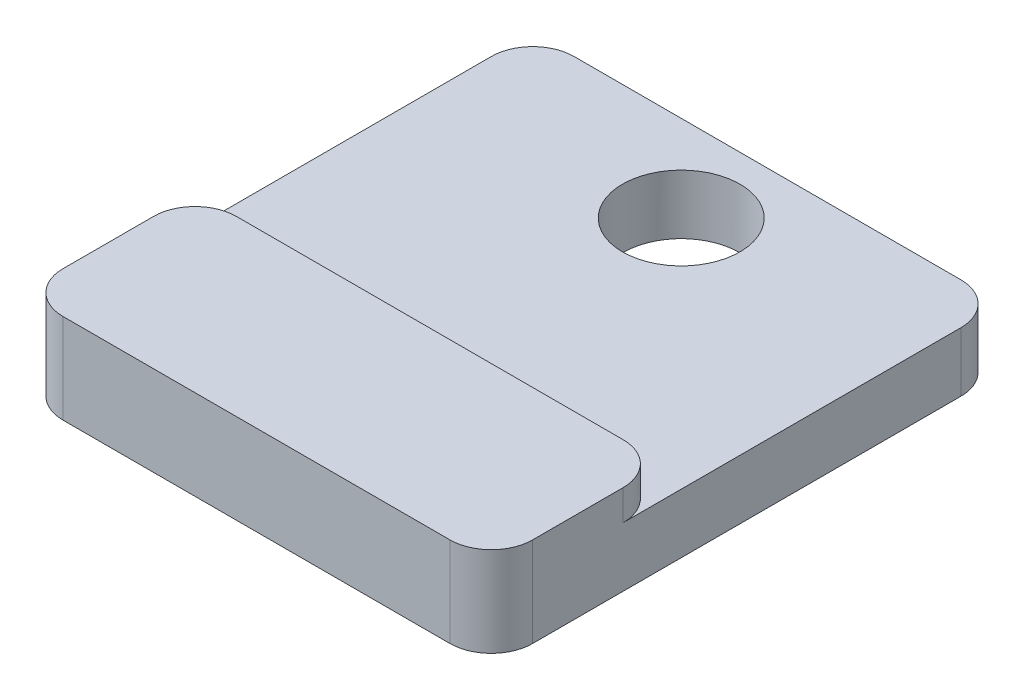
ISO-10303-21;
HEADER;
FILE_DESCRIPTION(('STEP AP214'),'2;1');
FILE_NAME('part.step','',(''),(''),'','','');
FILE_SCHEMA(('AUTOMOTIVE_DESIGN { 1 0 10303 214 1 1 1 1 }'));
ENDSEC;
DATA;
#1=APPLICATION_CONTEXT('core data for automotive mechanical design processes');
#2=APPLICATION_PROTOCOL_DEFINITION('international standard','automotive_design',2000,#1);
#3=PRODUCT_CONTEXT('',#1,'mechanical');
#4=PRODUCT('Part','Part','',(#3));
#5=PRODUCT_RELATED_PRODUCT_CATEGORY('part','',(#4));
#6=PRODUCT_DEFINITION_FORMATION('','',#4);
#7=PRODUCT_DEFINITION_CONTEXT('part definition',#1,'design');
#8=PRODUCT_DEFINITION('design','',#6,#7);
#9=PRODUCT_DEFINITION_SHAPE('','',#8);
#10=(LENGTH_UNIT() NAMED_UNIT(*) SI_UNIT(.MILLI.,.METRE.));
#11=(NAMED_UNIT(*) PLANE_ANGLE_UNIT() SI_UNIT($,.RADIAN.));
#12=(NAMED_UNIT(*) SI_UNIT($,.STERADIAN.) SOLID_ANGLE_UNIT());
#13=UNCERTAINTY_MEASURE_WITH_UNIT(LENGTH_MEASURE(1.E-05),#10,'distance_accuracy_value','');
#14=(GEOMETRIC_REPRESENTATION_CONTEXT(3) GLOBAL_UNCERTAINTY_ASSIGNED_CONTEXT((#13)) GLOBAL_UNIT_ASSIGNED_CONTEXT((#10,
#11,#12)) REPRESENTATION_CONTEXT('',''));
#15=CARTESIAN_POINT('',(0.,0.,0.));
#16=DIRECTION('',(0.,0.,1.));
#17=DIRECTION('',(1.,0.,0.));
#18=AXIS2_PLACEMENT_3D('',#15,#16,#17);
#19=CARTESIAN_POINT('',(0.,41.275,-234.95));
#20=DIRECTION('',(0.,0.,1.));
#21=DIRECTION('',(1.,0.,0.));
#22=AXIS2_PLACEMENT_3D('',#19,#20,#21);
#23=PLANE('',#22);
#24=DIRECTION('',(-1.,0.,0.));
#25=VECTOR('',#24,1.);
#26=CARTESIAN_POINT('',(196.85,27.305,-234.95));
#27=LINE('',#26,#25);
#28=CARTESIAN_POINT('',(196.85,27.305,-234.95));
#29=VERTEX_POINT('',#28);
#30=CARTESIAN_POINT('',(19.05,27.305,-234.95));
#31=VERTEX_POINT('',#30);
#32=EDGE_CURVE('E144',#29,#31,#27,.T.);
#33=ORIENTED_EDGE('',*,*,#32,.F.);
#34=DIRECTION('',(0.,-1.,0.));
#35=VECTOR('',#34,1.);
#36=CARTESIAN_POINT('',(196.85,41.275,-234.95));
#37=LINE('',#36,#35);
#38=CARTESIAN_POINT('',(196.85,0.,-234.95));
#39=VERTEX_POINT('',#38);
#40=EDGE_CURVE('E153',#29,#39,#37,.T.);
#41=ORIENTED_EDGE('',*,*,#40,.T.);
#42=DIRECTION('',(-1.,0.,0.));
#43=VECTOR('',#42,1.);
#44=CARTESIAN_POINT('',(0.,0.,-234.95));
#45=LINE('',#44,#43);
#46=CARTESIAN_POINT('',(19.05,0.,-234.95));
#47=VERTEX_POINT('',#46);
#48=EDGE_CURVE('E234',#39,#47,#45,.T.);
#49=ORIENTED_EDGE('',*,*,#48,.T.);
#50=DIRECTION('',(0.,-1.,0.));
#51=VECTOR('',#50,1.);
#52=CARTESIAN_POINT('',(19.05,41.275,-234.95));
#53=LINE('',#52,#51);
#54=EDGE_CURVE('E156',#47,#31,#53,.F.);
#55=ORIENTED_EDGE('',*,*,#54,.T.);
#56=EDGE_LOOP('',(#33,#41,#49,#55));
#57=FACE_BOUND('',#56,.T.);
#58=ADVANCED_FACE('F47',(#57),#23,.F.);
#59=CARTESIAN_POINT('',(19.05,41.275,-215.9));
#60=DIRECTION('',(0.,-1.,0.));
#61=DIRECTION('',(0.,0.,-1.));
#62=AXIS2_PLACEMENT_3D('',#59,#60,#61);
#63=CYLINDRICAL_SURFACE('',#62,19.05);
#64=DIRECTION('',(0.,-1.,0.));
#65=VECTOR('',#64,1.);
#66=CARTESIAN_POINT('',(0.,41.275,-215.9));
#67=LINE('',#66,#65);
#68=CARTESIAN_POINT('',(0.,27.305,-215.9));
#69=VERTEX_POINT('',#68);
#70=CARTESIAN_POINT('',(0.,0.,-215.9));
#71=VERTEX_POINT('',#70);
#72=EDGE_CURVE('E260',#69,#71,#67,.T.);
#73=ORIENTED_EDGE('',*,*,#72,.F.);
#74=CARTESIAN_POINT('',(19.05,27.305,-215.9));
#75=DIRECTION('',(0.,1.,0.));
#76=DIRECTION('',(0.,0.,1.));
#77=AXIS2_PLACEMENT_3D('',#74,#75,#76);
#78=CIRCLE('',#77,19.05);
#79=EDGE_CURVE('E157',#31,#69,#78,.T.);
#80=ORIENTED_EDGE('',*,*,#79,.F.);
#81=ORIENTED_EDGE('',*,*,#54,.F.);
#82=CARTESIAN_POINT('',(19.05,0.,-215.9));
#83=DIRECTION('',(0.,-1.,0.));
#84=DIRECTION('',(0.,0.,-1.));
#85=AXIS2_PLACEMENT_3D('',#82,#83,#84);
#86=CIRCLE('',#85,19.05);
#87=EDGE_CURVE('E162',#71,#47,#86,.T.);
#88=ORIENTED_EDGE('',*,*,#87,.F.);
#89=EDGE_LOOP('',(#73,#80,#81,#88));
#90=FACE_BOUND('',#89,.T.);
#91=ADVANCED_FACE('F287',(#90),#63,.T.);
#92=CARTESIAN_POINT('',(196.85,41.275,-215.9));
#93=DIRECTION('',(0.,-1.,0.));
#94=DIRECTION('',(0.,0.,-1.));
#95=AXIS2_PLACEMENT_3D('',#92,#93,#94);
#96=CYLINDRICAL_SURFACE('',#95,19.05);
#97=ORIENTED_EDGE('',*,*,#40,.F.);
#98=CARTESIAN_POINT('',(196.85,27.305,-215.9));
#99=DIRECTION('',(0.,1.,0.));
#100=DIRECTION('',(0.,0.,1.));
#101=AXIS2_PLACEMENT_3D('',#98,#99,#100);
#102=CIRCLE('',#101,19.05);
#103=CARTESIAN_POINT('',(215.9,27.305,-215.9));
#104=VERTEX_POINT('',#103);
#105=EDGE_CURVE('E140',#104,#29,#102,.T.);
#106=ORIENTED_EDGE('',*,*,#105,.F.);
#107=DIRECTION('',(0.,-1.,0.));
#108=VECTOR('',#107,1.);
#109=CARTESIAN_POINT('',(215.9,41.275,-215.9));
#110=LINE('',#109,#108);
#111=CARTESIAN_POINT('',(215.9,0.,-215.9));
#112=VERTEX_POINT('',#111);
#113=EDGE_CURVE('E175',#112,#104,#110,.F.);
#114=ORIENTED_EDGE('',*,*,#113,.F.);
#115=CARTESIAN_POINT('',(196.85,0.,-215.9));
#116=DIRECTION('',(0.,-1.,0.));
#117=DIRECTION('',(0.,0.,-1.));
#118=AXIS2_PLACEMENT_3D('',#115,#116,#117);
#119=CIRCLE('',#118,19.05);
#120=EDGE_CURVE('E160',#39,#112,#119,.T.);
#121=ORIENTED_EDGE('',*,*,#120,.F.);
#122=EDGE_LOOP('',(#97,#106,#114,#121));
#123=FACE_BOUND('',#122,.T.);
#124=ADVANCED_FACE('F159',(#123),#96,.T.);
#125=CARTESIAN_POINT('',(107.95,-0.001000000000001,-195.2625));
#126=DIRECTION('',(0.,1.,0.));
#127=DIRECTION('',(0.,0.,1.));
#128=AXIS2_PLACEMENT_3D('',#125,#126,#127);
#129=CYLINDRICAL_SURFACE('',#128,26.9875);
#130=CARTESIAN_POINT('',(107.95,0.,-195.2625));
#131=DIRECTION('',(0.,-1.,0.));
#132=DIRECTION('',(0.,0.,-1.));
#133=AXIS2_PLACEMENT_3D('',#130,#131,#132);
#134=CIRCLE('',#133,26.9875);
#135=CARTESIAN_POINT('',(107.95,0.,-222.25));
#136=VERTEX_POINT('',#135);
#137=EDGE_CURVE('E187',#136,#136,#134,.F.);
#138=ORIENTED_EDGE('',*,*,#137,.F.);
#139=EDGE_LOOP('',(#138));
#140=FACE_BOUND('',#139,.T.);
#141=CARTESIAN_POINT('',(107.95,27.305,-195.2625));
#142=DIRECTION('',(0.,1.,0.));
#143=DIRECTION('',(0.,0.,1.));
#144=AXIS2_PLACEMENT_3D('',#141,#142,#143);
#145=CIRCLE('',#144,26.9875);
#146=CARTESIAN_POINT('',(107.95,27.305,-168.275));
#147=VERTEX_POINT('',#146);
#148=EDGE_CURVE('E184',#147,#147,#145,.F.);
#149=ORIENTED_EDGE('',*,*,#148,.F.);
#150=EDGE_LOOP('',(#149));
#151=FACE_BOUND('',#150,.T.);
#152=ADVANCED_FACE('F312',(#140,#151),#129,.F.);
#153=CARTESIAN_POINT('',(0.,41.275,0.));
#154=DIRECTION('',(1.,0.,0.));
#155=DIRECTION('',(0.,0.,-1.));
#156=AXIS2_PLACEMENT_3D('',#153,#154,#155);
#157=PLANE('',#156);
#158=DIRECTION('',(0.,0.,1.));
#159=VECTOR('',#158,1.);
#160=CARTESIAN_POINT('',(0.,41.275,0.));
#161=LINE('',#160,#159);
#162=CARTESIAN_POINT('',(0.,41.275,-60.6425));
#163=VERTEX_POINT('',#162);
#164=CARTESIAN_POINT('',(0.,41.275,-19.05));
#165=VERTEX_POINT('',#164);
#166=EDGE_CURVE('E223',#163,#165,#161,.T.);
#167=ORIENTED_EDGE('',*,*,#166,.F.);
#168=DIRECTION('',(0.,1.,0.));
#169=VECTOR('',#168,1.);
#170=CARTESIAN_POINT('',(0.,41.275,-60.6425));
#171=LINE('',#170,#169);
#172=CARTESIAN_POINT('',(0.,27.305,-60.6425));
#173=VERTEX_POINT('',#172);
#174=EDGE_CURVE('E199',#163,#173,#171,.F.);
#175=ORIENTED_EDGE('',*,*,#174,.T.);
#176=DIRECTION('',(0.,0.,1.));
#177=VECTOR('',#176,1.);
#178=CARTESIAN_POINT('',(0.,27.305,-215.9));
#179=LINE('',#178,#177);
#180=EDGE_CURVE('E69',#69,#173,#179,.T.);
#181=ORIENTED_EDGE('',*,*,#180,.F.);
#182=ORIENTED_EDGE('',*,*,#72,.T.);
#183=DIRECTION('',(0.,0.,1.));
#184=VECTOR('',#183,1.);
#185=CARTESIAN_POINT('',(0.,0.,0.));
#186=LINE('',#185,#184);
#187=CARTESIAN_POINT('',(0.,0.,-19.05));
#188=VERTEX_POINT('',#187);
#189=EDGE_CURVE('E248',#71,#188,#186,.T.);
#190=ORIENTED_EDGE('',*,*,#189,.T.);
#191=DIRECTION('',(0.,-1.,0.));
#192=VECTOR('',#191,1.);
#193=CARTESIAN_POINT('',(0.,41.275,-19.05));
#194=LINE('',#193,#192);
#195=EDGE_CURVE('E230',#188,#165,#194,.F.);
#196=ORIENTED_EDGE('',*,*,#195,.T.);
#197=EDGE_LOOP('',(#167,#175,#181,#182,#190,#196));
#198=FACE_BOUND('',#197,.T.);
#199=ADVANCED_FACE('F227',(#198),#157,.F.);
#200=CARTESIAN_POINT('',(0.,41.275,0.));
#201=DIRECTION('',(0.,0.,-1.));
#202=DIRECTION('',(-1.,0.,0.));
#203=AXIS2_PLACEMENT_3D('',#200,#201,#202);
#204=PLANE('',#203);
#205=DIRECTION('',(1.,0.,0.));
#206=VECTOR('',#205,1.);
#207=CARTESIAN_POINT('',(0.,0.,0.));
#208=LINE('',#207,#206);
#209=CARTESIAN_POINT('',(19.05,0.,0.));
#210=VERTEX_POINT('',#209);
#211=CARTESIAN_POINT('',(196.85,0.,0.));
#212=VERTEX_POINT('',#211);
#213=EDGE_CURVE('E251',#210,#212,#208,.T.);
#214=ORIENTED_EDGE('',*,*,#213,.T.);
#215=DIRECTION('',(0.,-1.,0.));
#216=VECTOR('',#215,1.);
#217=CARTESIAN_POINT('',(196.85,41.275,0.));
#218=LINE('',#217,#216);
#219=CARTESIAN_POINT('',(196.85,41.275,0.));
#220=VERTEX_POINT('',#219);
#221=EDGE_CURVE('E181',#212,#220,#218,.F.);
#222=ORIENTED_EDGE('',*,*,#221,.T.);
#223=DIRECTION('',(1.,0.,0.));
#224=VECTOR('',#223,1.);
#225=CARTESIAN_POINT('',(0.,41.275,0.));
#226=LINE('',#225,#224);
#227=CARTESIAN_POINT('',(19.05,41.275,0.));
#228=VERTEX_POINT('',#227);
#229=EDGE_CURVE('E233',#228,#220,#226,.T.);
#230=ORIENTED_EDGE('',*,*,#229,.F.);
#231=DIRECTION('',(0.,-1.,0.));
#232=VECTOR('',#231,1.);
#233=CARTESIAN_POINT('',(19.05,41.275,0.));
#234=LINE('',#233,#232);
#235=EDGE_CURVE('E177',#228,#210,#234,.T.);
#236=ORIENTED_EDGE('',*,*,#235,.T.);
#237=EDGE_LOOP('',(#214,#222,#230,#236));
#238=FACE_BOUND('',#237,.T.);
#239=ADVANCED_FACE('F279',(#238),#204,.F.);
#240=CARTESIAN_POINT('',(215.9,41.275,0.));
#241=DIRECTION('',(-1.,0.,0.));
#242=DIRECTION('',(0.,0.,1.));
#243=AXIS2_PLACEMENT_3D('',#240,#241,#242);
#244=PLANE('',#243);
#245=DIRECTION('',(0.,0.,-1.));
#246=VECTOR('',#245,1.);
#247=CARTESIAN_POINT('',(215.9,27.305,-79.6925000000001));
#248=LINE('',#247,#246);
#249=CARTESIAN_POINT('',(215.9,27.305,-60.6425000000001));
#250=VERTEX_POINT('',#249);
#251=EDGE_CURVE('E62',#250,#104,#248,.T.);
#252=ORIENTED_EDGE('',*,*,#251,.F.);
#253=DIRECTION('',(0.,1.,0.));
#254=VECTOR('',#253,1.);
#255=CARTESIAN_POINT('',(215.9,41.275,-60.6425000000001));
#256=LINE('',#255,#254);
#257=CARTESIAN_POINT('',(215.9,41.275,-60.6425000000001));
#258=VERTEX_POINT('',#257);
#259=EDGE_CURVE('E202',#250,#258,#256,.T.);
#260=ORIENTED_EDGE('',*,*,#259,.T.);
#261=DIRECTION('',(0.,0.,-1.));
#262=VECTOR('',#261,1.);
#263=CARTESIAN_POINT('',(215.9,41.275,0.));
#264=LINE('',#263,#262);
#265=CARTESIAN_POINT('',(215.9,41.275,-19.05));
#266=VERTEX_POINT('',#265);
#267=EDGE_CURVE('E239',#266,#258,#264,.T.);
#268=ORIENTED_EDGE('',*,*,#267,.F.);
#269=DIRECTION('',(0.,-1.,0.));
#270=VECTOR('',#269,1.);
#271=CARTESIAN_POINT('',(215.9,41.275,-19.05));
#272=LINE('',#271,#270);
#273=CARTESIAN_POINT('',(215.9,0.,-19.05));
#274=VERTEX_POINT('',#273);
#275=EDGE_CURVE('E172',#266,#274,#272,.T.);
#276=ORIENTED_EDGE('',*,*,#275,.T.);
#277=DIRECTION('',(0.,0.,-1.));
#278=VECTOR('',#277,1.);
#279=CARTESIAN_POINT('',(215.9,0.,0.));
#280=LINE('',#279,#278);
#281=EDGE_CURVE('E241',#274,#112,#280,.T.);
#282=ORIENTED_EDGE('',*,*,#281,.T.);
#283=ORIENTED_EDGE('',*,*,#113,.T.);
#284=EDGE_LOOP('',(#252,#260,#268,#276,#282,#283));
#285=FACE_BOUND('',#284,.T.);
#286=ADVANCED_FACE('F270',(#285),#244,.F.);
#287=CARTESIAN_POINT('',(0.,41.275,0.));
#288=DIRECTION('',(0.,-1.,0.));
#289=DIRECTION('',(0.,0.,-1.));
#290=AXIS2_PLACEMENT_3D('',#287,#288,#289);
#291=PLANE('',#290);
#292=DIRECTION('',(1.,0.,0.));
#293=VECTOR('',#292,1.);
#294=CARTESIAN_POINT('',(215.9,41.275,-79.6925000000001));
#295=LINE('',#294,#293);
#296=CARTESIAN_POINT('',(19.05,41.275,-79.6925));
#297=VERTEX_POINT('',#296);
#298=CARTESIAN_POINT('',(196.85,41.275,-79.6925000000001));
#299=VERTEX_POINT('',#298);
#300=EDGE_CURVE('E225',#297,#299,#295,.T.);
#301=ORIENTED_EDGE('',*,*,#300,.F.);
#302=CARTESIAN_POINT('',(19.05,41.275,-60.6425));
#303=DIRECTION('',(0.,-1.,0.));
#304=DIRECTION('',(0.,0.,-1.));
#305=AXIS2_PLACEMENT_3D('',#302,#303,#304);
#306=CIRCLE('',#305,19.05);
#307=EDGE_CURVE('E196',#297,#163,#306,.F.);
#308=ORIENTED_EDGE('',*,*,#307,.T.);
#309=ORIENTED_EDGE('',*,*,#166,.T.);
#310=CARTESIAN_POINT('',(19.05,41.275,-19.05));
#311=DIRECTION('',(0.,-1.,0.));
#312=DIRECTION('',(0.,0.,-1.));
#313=AXIS2_PLACEMENT_3D('',#310,#311,#312);
#314=CIRCLE('',#313,19.05);
#315=EDGE_CURVE('E164',#165,#228,#314,.F.);
#316=ORIENTED_EDGE('',*,*,#315,.T.);
#317=ORIENTED_EDGE('',*,*,#229,.T.);
#318=CARTESIAN_POINT('',(196.85,41.275,-19.05));
#319=DIRECTION('',(0.,-1.,0.));
#320=DIRECTION('',(0.,0.,-1.));
#321=AXIS2_PLACEMENT_3D('',#318,#319,#320);
#322=CIRCLE('',#321,19.05);
#323=EDGE_CURVE('E170',#220,#266,#322,.F.);
#324=ORIENTED_EDGE('',*,*,#323,.T.);
#325=ORIENTED_EDGE('',*,*,#267,.T.);
#326=CARTESIAN_POINT('',(196.85,41.275,-60.6425000000001));
#327=DIRECTION('',(0.,-1.,0.));
#328=DIRECTION('',(0.,0.,-1.));
#329=AXIS2_PLACEMENT_3D('',#326,#327,#328);
#330=CIRCLE('',#329,19.05);
#331=EDGE_CURVE('E194',#258,#299,#330,.F.);
#332=ORIENTED_EDGE('',*,*,#331,.T.);
#333=EDGE_LOOP('',(#301,#308,#309,#316,#317,#324,#325,#332));
#334=FACE_BOUND('',#333,.T.);
#335=ADVANCED_FACE('F222',(#334),#291,.F.);
#336=CARTESIAN_POINT('',(0.,0.,0.));
#337=DIRECTION('',(0.,-1.,0.));
#338=DIRECTION('',(0.,0.,-1.));
#339=AXIS2_PLACEMENT_3D('',#336,#337,#338);
#340=PLANE('',#339);
#341=ORIENTED_EDGE('',*,*,#137,.T.);
#342=EDGE_LOOP('',(#341));
#343=FACE_BOUND('',#342,.T.);
#344=ORIENTED_EDGE('',*,*,#189,.F.);
#345=ORIENTED_EDGE('',*,*,#87,.T.);
#346=ORIENTED_EDGE('',*,*,#48,.F.);
#347=ORIENTED_EDGE('',*,*,#120,.T.);
#348=ORIENTED_EDGE('',*,*,#281,.F.);
#349=CARTESIAN_POINT('',(196.85,0.,-19.05));
#350=DIRECTION('',(0.,-1.,0.));
#351=DIRECTION('',(0.,0.,-1.));
#352=AXIS2_PLACEMENT_3D('',#349,#350,#351);
#353=CIRCLE('',#352,19.05);
#354=EDGE_CURVE('E265',#274,#212,#353,.T.);
#355=ORIENTED_EDGE('',*,*,#354,.T.);
#356=ORIENTED_EDGE('',*,*,#213,.F.);
#357=CARTESIAN_POINT('',(19.05,0.,-19.05));
#358=DIRECTION('',(0.,-1.,0.));
#359=DIRECTION('',(0.,0.,-1.));
#360=AXIS2_PLACEMENT_3D('',#357,#358,#359);
#361=CIRCLE('',#360,19.05);
#362=EDGE_CURVE('E262',#210,#188,#361,.T.);
#363=ORIENTED_EDGE('',*,*,#362,.T.);
#364=EDGE_LOOP('',(#344,#345,#346,#347,#348,#355,#356,#363));
#365=FACE_BOUND('',#364,.T.);
#366=ADVANCED_FACE('F269',(#343,#365),#340,.T.);
#367=CARTESIAN_POINT('',(196.85,41.275,-19.05));
#368=DIRECTION('',(0.,-1.,0.));
#369=DIRECTION('',(0.,0.,-1.));
#370=AXIS2_PLACEMENT_3D('',#367,#368,#369);
#371=CYLINDRICAL_SURFACE('',#370,19.05);
#372=ORIENTED_EDGE('',*,*,#323,.F.);
#373=ORIENTED_EDGE('',*,*,#221,.F.);
#374=ORIENTED_EDGE('',*,*,#354,.F.);
#375=ORIENTED_EDGE('',*,*,#275,.F.);
#376=EDGE_LOOP('',(#372,#373,#374,#375));
#377=FACE_BOUND('',#376,.T.);
#378=ADVANCED_FACE('F275',(#377),#371,.T.);
#379=CARTESIAN_POINT('',(19.05,41.275,-19.05));
#380=DIRECTION('',(0.,-1.,0.));
#381=DIRECTION('',(0.,0.,-1.));
#382=AXIS2_PLACEMENT_3D('',#379,#380,#381);
#383=CYLINDRICAL_SURFACE('',#382,19.05);
#384=ORIENTED_EDGE('',*,*,#315,.F.);
#385=ORIENTED_EDGE('',*,*,#195,.F.);
#386=ORIENTED_EDGE('',*,*,#362,.F.);
#387=ORIENTED_EDGE('',*,*,#235,.F.);
#388=EDGE_LOOP('',(#384,#385,#386,#387));
#389=FACE_BOUND('',#388,.T.);
#390=ADVANCED_FACE('F283',(#389),#383,.T.);
#391=CARTESIAN_POINT('',(196.85,27.305,-215.9));
#392=DIRECTION('',(0.,1.,0.));
#393=DIRECTION('',(0.,0.,1.));
#394=AXIS2_PLACEMENT_3D('',#391,#392,#393);
#395=PLANE('',#394);
#396=ORIENTED_EDGE('',*,*,#251,.T.);
#397=ORIENTED_EDGE('',*,*,#105,.T.);
#398=ORIENTED_EDGE('',*,*,#32,.T.);
#399=ORIENTED_EDGE('',*,*,#79,.T.);
#400=ORIENTED_EDGE('',*,*,#180,.T.);
#401=CARTESIAN_POINT('',(19.05,27.305,-60.6425));
#402=DIRECTION('',(0.,1.,0.));
#403=DIRECTION('',(0.,0.,1.));
#404=AXIS2_PLACEMENT_3D('',#401,#402,#403);
#405=CIRCLE('',#404,19.05);
#406=CARTESIAN_POINT('',(19.05,27.305,-79.6925));
#407=VERTEX_POINT('',#406);
#408=EDGE_CURVE('E55',#173,#407,#405,.F.);
#409=ORIENTED_EDGE('',*,*,#408,.T.);
#410=DIRECTION('',(1.,0.,0.));
#411=VECTOR('',#410,1.);
#412=CARTESIAN_POINT('',(215.9,27.305,-79.6925000000001));
#413=LINE('',#412,#411);
#414=CARTESIAN_POINT('',(196.85,27.305,-79.6925000000001));
#415=VERTEX_POINT('',#414);
#416=EDGE_CURVE('E188',#407,#415,#413,.T.);
#417=ORIENTED_EDGE('',*,*,#416,.T.);
#418=CARTESIAN_POINT('',(196.85,27.305,-60.6425000000001));
#419=DIRECTION('',(0.,1.,0.));
#420=DIRECTION('',(0.,0.,1.));
#421=AXIS2_PLACEMENT_3D('',#418,#419,#420);
#422=CIRCLE('',#421,19.05);
#423=EDGE_CURVE('E11',#415,#250,#422,.F.);
#424=ORIENTED_EDGE('',*,*,#423,.T.);
#425=EDGE_LOOP('',(#396,#397,#398,#399,#400,#409,#417,#424));
#426=FACE_BOUND('',#425,.T.);
#427=ORIENTED_EDGE('',*,*,#148,.T.);
#428=EDGE_LOOP('',(#427));
#429=FACE_BOUND('',#428,.T.);
#430=ADVANCED_FACE('F142',(#426,#429),#395,.T.);
#431=CARTESIAN_POINT('',(215.9,27.305,-79.6925000000001));
#432=DIRECTION('',(0.,0.,1.));
#433=DIRECTION('',(1.,0.,0.));
#434=AXIS2_PLACEMENT_3D('',#431,#432,#433);
#435=PLANE('',#434);
#436=ORIENTED_EDGE('',*,*,#416,.F.);
#437=DIRECTION('',(0.,1.,0.));
#438=VECTOR('',#437,1.);
#439=CARTESIAN_POINT('',(19.05,27.305,-79.6925));
#440=LINE('',#439,#438);
#441=EDGE_CURVE('E190',#407,#297,#440,.T.);
#442=ORIENTED_EDGE('',*,*,#441,.T.);
#443=ORIENTED_EDGE('',*,*,#300,.T.);
#444=DIRECTION('',(0.,1.,0.));
#445=VECTOR('',#444,1.);
#446=CARTESIAN_POINT('',(196.85,27.305,-79.6925000000001));
#447=LINE('',#446,#445);
#448=EDGE_CURVE('E183',#299,#415,#447,.F.);
#449=ORIENTED_EDGE('',*,*,#448,.T.);
#450=EDGE_LOOP('',(#436,#442,#443,#449));
#451=FACE_BOUND('',#450,.T.);
#452=ADVANCED_FACE('F213',(#451),#435,.F.);
#453=CARTESIAN_POINT('',(19.05,27.305,-60.6425));
#454=DIRECTION('',(0.,1.,0.));
#455=DIRECTION('',(0.,0.,1.));
#456=AXIS2_PLACEMENT_3D('',#453,#454,#455);
#457=CYLINDRICAL_SURFACE('',#456,19.05);
#458=ORIENTED_EDGE('',*,*,#408,.F.);
#459=ORIENTED_EDGE('',*,*,#174,.F.);
#460=ORIENTED_EDGE('',*,*,#307,.F.);
#461=ORIENTED_EDGE('',*,*,#441,.F.);
#462=EDGE_LOOP('',(#458,#459,#460,#461));
#463=FACE_BOUND('',#462,.T.);
#464=ADVANCED_FACE('F219',(#463),#457,.T.);
#465=CARTESIAN_POINT('',(196.85,41.275,-60.6425000000001));
#466=DIRECTION('',(0.,1.,0.));
#467=DIRECTION('',(0.,0.,1.));
#468=AXIS2_PLACEMENT_3D('',#465,#466,#467);
#469=CYLINDRICAL_SURFACE('',#468,19.05);
#470=ORIENTED_EDGE('',*,*,#423,.F.);
#471=ORIENTED_EDGE('',*,*,#448,.F.);
#472=ORIENTED_EDGE('',*,*,#331,.F.);
#473=ORIENTED_EDGE('',*,*,#259,.F.);
#474=EDGE_LOOP('',(#470,#471,#472,#473));
#475=FACE_BOUND('',#474,.T.);
#476=ADVANCED_FACE('F49',(#475),#469,.T.);
#477=CLOSED_SHELL('',(#58,#91,#124,#152,#199,#239,#286,#335,#366,#378,#390,#430,#452,#464,#476));
#478=MANIFOLD_SOLID_BREP('B2',#477);
#479=ADVANCED_BREP_SHAPE_REPRESENTATION('',(#18,#478),#14);
#480=SHAPE_DEFINITION_REPRESENTATION(#9,#479);
ENDSEC;
END-ISO-10303-21;
